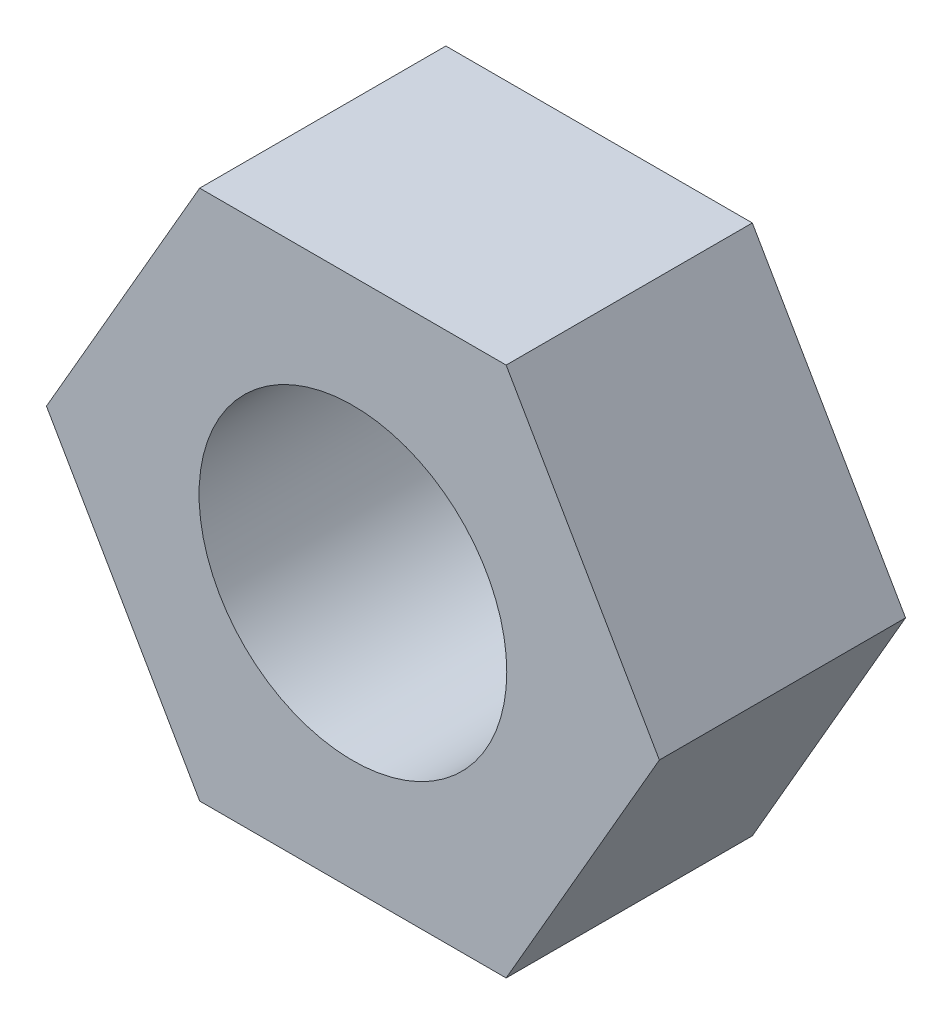
ISO-10303-21;
HEADER;
FILE_DESCRIPTION(('STEP AP214'),'2;1');
FILE_NAME('part.step','',(''),(''),'','','');
FILE_SCHEMA(('AUTOMOTIVE_DESIGN { 1 0 10303 214 1 1 1 1 }'));
ENDSEC;
DATA;
#1=APPLICATION_CONTEXT('core data for automotive mechanical design processes');
#2=APPLICATION_PROTOCOL_DEFINITION('international standard','automotive_design',2000,#1);
#3=PRODUCT_CONTEXT('',#1,'mechanical');
#4=PRODUCT('Part','Part','',(#3));
#5=PRODUCT_RELATED_PRODUCT_CATEGORY('part','',(#4));
#6=PRODUCT_DEFINITION_FORMATION('','',#4);
#7=PRODUCT_DEFINITION_CONTEXT('part definition',#1,'design');
#8=PRODUCT_DEFINITION('design','',#6,#7);
#9=PRODUCT_DEFINITION_SHAPE('','',#8);
#10=(LENGTH_UNIT() NAMED_UNIT(*) SI_UNIT(.MILLI.,.METRE.));
#11=(NAMED_UNIT(*) PLANE_ANGLE_UNIT() SI_UNIT($,.RADIAN.));
#12=(NAMED_UNIT(*) SI_UNIT($,.STERADIAN.) SOLID_ANGLE_UNIT());
#13=UNCERTAINTY_MEASURE_WITH_UNIT(LENGTH_MEASURE(1.E-05),#10,'distance_accuracy_value','');
#14=(GEOMETRIC_REPRESENTATION_CONTEXT(3) GLOBAL_UNCERTAINTY_ASSIGNED_CONTEXT((#13)) GLOBAL_UNIT_ASSIGNED_CONTEXT((#10,
#11,#12)) REPRESENTATION_CONTEXT('',''));
#15=CARTESIAN_POINT('',(0.,0.,0.));
#16=DIRECTION('',(0.,0.,1.));
#17=DIRECTION('',(1.,0.,0.));
#18=AXIS2_PLACEMENT_3D('',#15,#16,#17);
#19=CARTESIAN_POINT('',(-1.99185842870421,-3.45,3.2));
#20=DIRECTION('',(0.,1.,0.));
#21=DIRECTION('',(0.,0.,1.));
#22=AXIS2_PLACEMENT_3D('',#19,#20,#21);
#23=PLANE('',#22);
#24=DIRECTION('',(1.,0.,0.));
#25=VECTOR('',#24,1.);
#26=CARTESIAN_POINT('',(-1.99185842870421,-3.45,0.));
#27=LINE('',#26,#25);
#28=CARTESIAN_POINT('',(-1.99185842870421,-3.45,0.));
#29=VERTEX_POINT('',#28);
#30=CARTESIAN_POINT('',(1.99185842870421,-3.45,0.));
#31=VERTEX_POINT('',#30);
#32=EDGE_CURVE('E128',#29,#31,#27,.T.);
#33=ORIENTED_EDGE('',*,*,#32,.T.);
#34=DIRECTION('',(0.,0.,-1.));
#35=VECTOR('',#34,1.);
#36=CARTESIAN_POINT('',(1.99185842870421,-3.45,3.2));
#37=LINE('',#36,#35);
#38=CARTESIAN_POINT('',(1.99185842870421,-3.45,3.2));
#39=VERTEX_POINT('',#38);
#40=EDGE_CURVE('E11',#39,#31,#37,.T.);
#41=ORIENTED_EDGE('',*,*,#40,.F.);
#42=DIRECTION('',(1.,0.,0.));
#43=VECTOR('',#42,1.);
#44=CARTESIAN_POINT('',(-1.99185842870421,-3.45,3.2));
#45=LINE('',#44,#43);
#46=CARTESIAN_POINT('',(-1.99185842870421,-3.45,3.2));
#47=VERTEX_POINT('',#46);
#48=EDGE_CURVE('E145',#47,#39,#45,.T.);
#49=ORIENTED_EDGE('',*,*,#48,.F.);
#50=DIRECTION('',(0.,0.,-1.));
#51=VECTOR('',#50,1.);
#52=CARTESIAN_POINT('',(-1.99185842870421,-3.45,3.2));
#53=LINE('',#52,#51);
#54=EDGE_CURVE('E124',#47,#29,#53,.T.);
#55=ORIENTED_EDGE('',*,*,#54,.T.);
#56=EDGE_LOOP('',(#33,#41,#49,#55));
#57=FACE_BOUND('',#56,.T.);
#58=ADVANCED_FACE('F39',(#57),#23,.F.);
#59=CARTESIAN_POINT('',(1.99185842870421,-3.45,3.2));
#60=DIRECTION('',(-0.866025403784439,0.5,0.));
#61=DIRECTION('',(-0.5,-0.866025403784439,0.));
#62=AXIS2_PLACEMENT_3D('',#59,#60,#61);
#63=PLANE('',#62);
#64=DIRECTION('',(0.5,0.866025403784439,0.));
#65=VECTOR('',#64,1.);
#66=CARTESIAN_POINT('',(1.99185842870421,-3.45,0.));
#67=LINE('',#66,#65);
#68=CARTESIAN_POINT('',(3.98371685740842,0.,0.));
#69=VERTEX_POINT('',#68);
#70=EDGE_CURVE('E132',#31,#69,#67,.T.);
#71=ORIENTED_EDGE('',*,*,#70,.T.);
#72=DIRECTION('',(0.,0.,-1.));
#73=VECTOR('',#72,1.);
#74=CARTESIAN_POINT('',(3.98371685740842,0.,3.2));
#75=LINE('',#74,#73);
#76=CARTESIAN_POINT('',(3.98371685740842,0.,3.2));
#77=VERTEX_POINT('',#76);
#78=EDGE_CURVE('E48',#77,#69,#75,.T.);
#79=ORIENTED_EDGE('',*,*,#78,.F.);
#80=DIRECTION('',(0.5,0.866025403784439,0.));
#81=VECTOR('',#80,1.);
#82=CARTESIAN_POINT('',(1.99185842870421,-3.45,3.2));
#83=LINE('',#82,#81);
#84=EDGE_CURVE('E93',#39,#77,#83,.T.);
#85=ORIENTED_EDGE('',*,*,#84,.F.);
#86=ORIENTED_EDGE('',*,*,#40,.T.);
#87=EDGE_LOOP('',(#71,#79,#85,#86));
#88=FACE_BOUND('',#87,.T.);
#89=ADVANCED_FACE('F174',(#88),#63,.F.);
#90=CARTESIAN_POINT('',(3.98371685740842,0.,3.2));
#91=DIRECTION('',(-0.866025403784438,-0.5,0.));
#92=DIRECTION('',(0.5,-0.866025403784438,0.));
#93=AXIS2_PLACEMENT_3D('',#90,#91,#92);
#94=PLANE('',#93);
#95=DIRECTION('',(-0.5,0.866025403784438,0.));
#96=VECTOR('',#95,1.);
#97=CARTESIAN_POINT('',(3.98371685740842,0.,0.));
#98=LINE('',#97,#96);
#99=CARTESIAN_POINT('',(1.99185842870421,3.45,0.));
#100=VERTEX_POINT('',#99);
#101=EDGE_CURVE('E136',#69,#100,#98,.T.);
#102=ORIENTED_EDGE('',*,*,#101,.T.);
#103=DIRECTION('',(0.,0.,-1.));
#104=VECTOR('',#103,1.);
#105=CARTESIAN_POINT('',(1.99185842870421,3.45,3.2));
#106=LINE('',#105,#104);
#107=CARTESIAN_POINT('',(1.99185842870421,3.45,3.2));
#108=VERTEX_POINT('',#107);
#109=EDGE_CURVE('E117',#108,#100,#106,.T.);
#110=ORIENTED_EDGE('',*,*,#109,.F.);
#111=DIRECTION('',(-0.5,0.866025403784438,0.));
#112=VECTOR('',#111,1.);
#113=CARTESIAN_POINT('',(3.98371685740842,0.,3.2));
#114=LINE('',#113,#112);
#115=EDGE_CURVE('E106',#77,#108,#114,.T.);
#116=ORIENTED_EDGE('',*,*,#115,.F.);
#117=ORIENTED_EDGE('',*,*,#78,.T.);
#118=EDGE_LOOP('',(#102,#110,#116,#117));
#119=FACE_BOUND('',#118,.T.);
#120=ADVANCED_FACE('F155',(#119),#94,.F.);
#121=CARTESIAN_POINT('',(1.99185842870421,3.45,3.2));
#122=DIRECTION('',(0.,-1.,0.));
#123=DIRECTION('',(1.,0.,0.));
#124=AXIS2_PLACEMENT_3D('',#121,#122,#123);
#125=PLANE('',#124);
#126=DIRECTION('',(-1.,0.,0.));
#127=VECTOR('',#126,1.);
#128=CARTESIAN_POINT('',(1.99185842870421,3.45,0.));
#129=LINE('',#128,#127);
#130=CARTESIAN_POINT('',(-1.99185842870421,3.45,0.));
#131=VERTEX_POINT('',#130);
#132=EDGE_CURVE('E115',#100,#131,#129,.T.);
#133=ORIENTED_EDGE('',*,*,#132,.T.);
#134=DIRECTION('',(0.,0.,-1.));
#135=VECTOR('',#134,1.);
#136=CARTESIAN_POINT('',(-1.99185842870421,3.45,3.2));
#137=LINE('',#136,#135);
#138=CARTESIAN_POINT('',(-1.99185842870421,3.45,3.2));
#139=VERTEX_POINT('',#138);
#140=EDGE_CURVE('E112',#139,#131,#137,.T.);
#141=ORIENTED_EDGE('',*,*,#140,.F.);
#142=DIRECTION('',(-1.,0.,0.));
#143=VECTOR('',#142,1.);
#144=CARTESIAN_POINT('',(1.99185842870421,3.45,3.2));
#145=LINE('',#144,#143);
#146=EDGE_CURVE('E100',#108,#139,#145,.T.);
#147=ORIENTED_EDGE('',*,*,#146,.F.);
#148=ORIENTED_EDGE('',*,*,#109,.T.);
#149=EDGE_LOOP('',(#133,#141,#147,#148));
#150=FACE_BOUND('',#149,.T.);
#151=ADVANCED_FACE('F113',(#150),#125,.F.);
#152=CARTESIAN_POINT('',(-1.99185842870421,3.45,3.2));
#153=DIRECTION('',(0.866025403784439,-0.5,0.));
#154=DIRECTION('',(0.5,0.866025403784439,0.));
#155=AXIS2_PLACEMENT_3D('',#152,#153,#154);
#156=PLANE('',#155);
#157=DIRECTION('',(-0.5,-0.866025403784439,0.));
#158=VECTOR('',#157,1.);
#159=CARTESIAN_POINT('',(-1.99185842870421,3.45,0.));
#160=LINE('',#159,#158);
#161=CARTESIAN_POINT('',(-3.98371685740842,0.,0.));
#162=VERTEX_POINT('',#161);
#163=EDGE_CURVE('E79',#131,#162,#160,.T.);
#164=ORIENTED_EDGE('',*,*,#163,.T.);
#165=DIRECTION('',(0.,0.,-1.));
#166=VECTOR('',#165,1.);
#167=CARTESIAN_POINT('',(-3.98371685740842,0.,3.2));
#168=LINE('',#167,#166);
#169=CARTESIAN_POINT('',(-3.98371685740842,0.,3.2));
#170=VERTEX_POINT('',#169);
#171=EDGE_CURVE('E118',#170,#162,#168,.T.);
#172=ORIENTED_EDGE('',*,*,#171,.F.);
#173=DIRECTION('',(-0.5,-0.866025403784439,0.));
#174=VECTOR('',#173,1.);
#175=CARTESIAN_POINT('',(-1.99185842870421,3.45,3.2));
#176=LINE('',#175,#174);
#177=EDGE_CURVE('E104',#139,#170,#176,.T.);
#178=ORIENTED_EDGE('',*,*,#177,.F.);
#179=ORIENTED_EDGE('',*,*,#140,.T.);
#180=EDGE_LOOP('',(#164,#172,#178,#179));
#181=FACE_BOUND('',#180,.T.);
#182=ADVANCED_FACE('F120',(#181),#156,.F.);
#183=CARTESIAN_POINT('',(-3.98371685740842,0.,3.2));
#184=DIRECTION('',(0.866025403784438,0.5,0.));
#185=DIRECTION('',(-0.5,0.866025403784438,0.));
#186=AXIS2_PLACEMENT_3D('',#183,#184,#185);
#187=PLANE('',#186);
#188=DIRECTION('',(0.5,-0.866025403784439,0.));
#189=VECTOR('',#188,1.);
#190=CARTESIAN_POINT('',(-3.98371685740842,0.,0.));
#191=LINE('',#190,#189);
#192=EDGE_CURVE('E85',#162,#29,#191,.T.);
#193=ORIENTED_EDGE('',*,*,#192,.T.);
#194=ORIENTED_EDGE('',*,*,#54,.F.);
#195=DIRECTION('',(0.5,-0.866025403784439,0.));
#196=VECTOR('',#195,1.);
#197=CARTESIAN_POINT('',(-3.98371685740842,0.,3.2));
#198=LINE('',#197,#196);
#199=EDGE_CURVE('E56',#170,#47,#198,.T.);
#200=ORIENTED_EDGE('',*,*,#199,.F.);
#201=ORIENTED_EDGE('',*,*,#171,.T.);
#202=EDGE_LOOP('',(#193,#194,#200,#201));
#203=FACE_BOUND('',#202,.T.);
#204=ADVANCED_FACE('F162',(#203),#187,.F.);
#205=CARTESIAN_POINT('',(0.,0.,3.2));
#206=DIRECTION('',(0.,0.,1.));
#207=DIRECTION('',(1.,0.,0.));
#208=AXIS2_PLACEMENT_3D('',#205,#206,#207);
#209=PLANE('',#208);
#210=CARTESIAN_POINT('',(0.,0.,3.2));
#211=DIRECTION('',(0.,0.,1.));
#212=DIRECTION('',(1.,0.,0.));
#213=AXIS2_PLACEMENT_3D('',#210,#211,#212);
#214=CIRCLE('',#213,2.);
#215=CARTESIAN_POINT('',(2.,0.,3.2));
#216=VERTEX_POINT('',#215);
#217=EDGE_CURVE('E227',#216,#216,#214,.T.);
#218=ORIENTED_EDGE('',*,*,#217,.F.);
#219=EDGE_LOOP('',(#218));
#220=FACE_BOUND('',#219,.T.);
#221=ORIENTED_EDGE('',*,*,#48,.T.);
#222=ORIENTED_EDGE('',*,*,#84,.T.);
#223=ORIENTED_EDGE('',*,*,#115,.T.);
#224=ORIENTED_EDGE('',*,*,#146,.T.);
#225=ORIENTED_EDGE('',*,*,#177,.T.);
#226=ORIENTED_EDGE('',*,*,#199,.T.);
#227=EDGE_LOOP('',(#221,#222,#223,#224,#225,#226));
#228=FACE_BOUND('',#227,.T.);
#229=ADVANCED_FACE('F102',(#220,#228),#209,.T.);
#230=CARTESIAN_POINT('',(0.,0.,0.));
#231=DIRECTION('',(0.,0.,1.));
#232=DIRECTION('',(1.,0.,0.));
#233=AXIS2_PLACEMENT_3D('',#230,#231,#232);
#234=PLANE('',#233);
#235=CARTESIAN_POINT('',(0.,0.,0.));
#236=DIRECTION('',(0.,0.,1.));
#237=DIRECTION('',(1.,0.,0.));
#238=AXIS2_PLACEMENT_3D('',#235,#236,#237);
#239=CIRCLE('',#238,2.);
#240=CARTESIAN_POINT('',(2.,0.,0.));
#241=VERTEX_POINT('',#240);
#242=EDGE_CURVE('E133',#241,#241,#239,.F.);
#243=ORIENTED_EDGE('',*,*,#242,.F.);
#244=EDGE_LOOP('',(#243));
#245=FACE_BOUND('',#244,.T.);
#246=ORIENTED_EDGE('',*,*,#32,.F.);
#247=ORIENTED_EDGE('',*,*,#192,.F.);
#248=ORIENTED_EDGE('',*,*,#163,.F.);
#249=ORIENTED_EDGE('',*,*,#132,.F.);
#250=ORIENTED_EDGE('',*,*,#101,.F.);
#251=ORIENTED_EDGE('',*,*,#70,.F.);
#252=EDGE_LOOP('',(#246,#247,#248,#249,#250,#251));
#253=FACE_BOUND('',#252,.T.);
#254=ADVANCED_FACE('F158',(#245,#253),#234,.F.);
#255=CARTESIAN_POINT('',(0.,0.,-0.00100000000000013));
#256=DIRECTION('',(0.,0.,1.));
#257=DIRECTION('',(1.,0.,0.));
#258=AXIS2_PLACEMENT_3D('',#255,#256,#257);
#259=CYLINDRICAL_SURFACE('',#258,2.);
#260=ORIENTED_EDGE('',*,*,#217,.T.);
#261=EDGE_LOOP('',(#260));
#262=FACE_BOUND('',#261,.T.);
#263=ORIENTED_EDGE('',*,*,#242,.T.);
#264=EDGE_LOOP('',(#263));
#265=FACE_BOUND('',#264,.T.);
#266=ADVANCED_FACE('F211',(#262,#265),#259,.F.);
#267=CLOSED_SHELL('',(#58,#89,#120,#151,#182,#204,#229,#254,#266));
#268=MANIFOLD_SOLID_BREP('B2',#267);
#269=ADVANCED_BREP_SHAPE_REPRESENTATION('',(#18,#268),#14);
#270=SHAPE_DEFINITION_REPRESENTATION(#9,#269);
ENDSEC;
END-ISO-10303-21;
